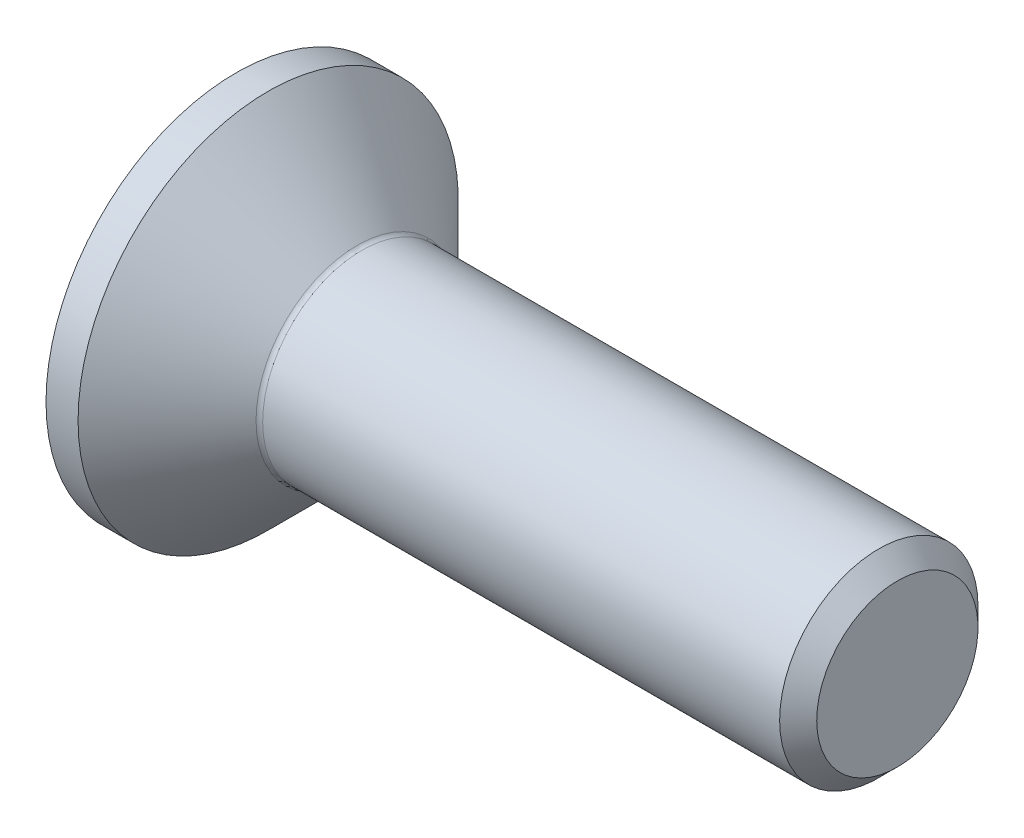
ISO-10303-21;
HEADER;
FILE_DESCRIPTION(('STEP AP214'),'2;1');
FILE_NAME('part.step','',(''),(''),'','','');
FILE_SCHEMA(('AUTOMOTIVE_DESIGN { 1 0 10303 214 1 1 1 1 }'));
ENDSEC;
DATA;
#1=APPLICATION_CONTEXT('core data for automotive mechanical design processes');
#2=APPLICATION_PROTOCOL_DEFINITION('international standard','automotive_design',2000,#1);
#3=PRODUCT_CONTEXT('',#1,'mechanical');
#4=PRODUCT('Part','Part','',(#3));
#5=PRODUCT_RELATED_PRODUCT_CATEGORY('part','',(#4));
#6=PRODUCT_DEFINITION_FORMATION('','',#4);
#7=PRODUCT_DEFINITION_CONTEXT('part definition',#1,'design');
#8=PRODUCT_DEFINITION('design','',#6,#7);
#9=PRODUCT_DEFINITION_SHAPE('','',#8);
#10=(LENGTH_UNIT() NAMED_UNIT(*) SI_UNIT(.MILLI.,.METRE.));
#11=(NAMED_UNIT(*) PLANE_ANGLE_UNIT() SI_UNIT($,.RADIAN.));
#12=(NAMED_UNIT(*) SI_UNIT($,.STERADIAN.) SOLID_ANGLE_UNIT());
#13=UNCERTAINTY_MEASURE_WITH_UNIT(LENGTH_MEASURE(1.E-05),#10,'distance_accuracy_value','');
#14=(GEOMETRIC_REPRESENTATION_CONTEXT(3) GLOBAL_UNCERTAINTY_ASSIGNED_CONTEXT((#13)) GLOBAL_UNIT_ASSIGNED_CONTEXT((#10,
#11,#12)) REPRESENTATION_CONTEXT('',''));
#15=CARTESIAN_POINT('',(0.,0.,0.));
#16=DIRECTION('',(0.,0.,1.));
#17=DIRECTION('',(1.,0.,0.));
#18=AXIS2_PLACEMENT_3D('',#15,#16,#17);
#19=CARTESIAN_POINT('',(0.,0.,0.));
#20=DIRECTION('',(-1.,0.,0.));
#21=DIRECTION('',(0.,0.,1.));
#22=AXIS2_PLACEMENT_3D('',#19,#20,#21);
#23=PLANE('',#22);
#24=CARTESIAN_POINT('',(0.,0.,0.));
#25=DIRECTION('',(-1.,0.,0.));
#26=DIRECTION('',(0.,0.,1.));
#27=AXIS2_PLACEMENT_3D('',#24,#25,#26);
#28=CIRCLE('',#27,2.875);
#29=CARTESIAN_POINT('',(0.,0.,2.875));
#30=VERTEX_POINT('',#29);
#31=EDGE_CURVE('E154',#30,#30,#28,.T.);
#32=ORIENTED_EDGE('',*,*,#31,.T.);
#33=EDGE_LOOP('',(#32));
#34=FACE_BOUND('',#33,.T.);
#35=DIRECTION('',(0.,-0.499999999999998,-0.86602540378444));
#36=VECTOR('',#35,1.);
#37=CARTESIAN_POINT('',(0.,-0.577350269189626,1.));
#38=LINE('',#37,#36);
#39=CARTESIAN_POINT('',(0.,-0.577350269189626,1.));
#40=VERTEX_POINT('',#39);
#41=CARTESIAN_POINT('',(0.,-1.15470053837925,0.));
#42=VERTEX_POINT('',#41);
#43=EDGE_CURVE('E120',#40,#42,#38,.T.);
#44=ORIENTED_EDGE('',*,*,#43,.T.);
#45=DIRECTION('',(0.,0.499999999999999,-0.866025403784439));
#46=VECTOR('',#45,1.);
#47=CARTESIAN_POINT('',(0.,-1.15470053837925,0.));
#48=LINE('',#47,#46);
#49=CARTESIAN_POINT('',(0.,-0.577350269189625,-1.));
#50=VERTEX_POINT('',#49);
#51=EDGE_CURVE('E51',#42,#50,#48,.T.);
#52=ORIENTED_EDGE('',*,*,#51,.T.);
#53=DIRECTION('',(0.,1.,0.));
#54=VECTOR('',#53,1.);
#55=CARTESIAN_POINT('',(0.,-0.577350269189625,-1.));
#56=LINE('',#55,#54);
#57=CARTESIAN_POINT('',(0.,0.577350269189626,-1.));
#58=VERTEX_POINT('',#57);
#59=EDGE_CURVE('E131',#50,#58,#56,.T.);
#60=ORIENTED_EDGE('',*,*,#59,.T.);
#61=DIRECTION('',(0.,0.5,0.866025403784439));
#62=VECTOR('',#61,1.);
#63=CARTESIAN_POINT('',(0.,0.577350269189626,-1.));
#64=LINE('',#63,#62);
#65=CARTESIAN_POINT('',(0.,1.15470053837925,0.));
#66=VERTEX_POINT('',#65);
#67=EDGE_CURVE('E255',#58,#66,#64,.T.);
#68=ORIENTED_EDGE('',*,*,#67,.T.);
#69=DIRECTION('',(0.,-0.499999999999999,0.866025403784439));
#70=VECTOR('',#69,1.);
#71=CARTESIAN_POINT('',(0.,1.15470053837925,0.));
#72=LINE('',#71,#70);
#73=CARTESIAN_POINT('',(0.,0.577350269189625,0.999999999999999));
#74=VERTEX_POINT('',#73);
#75=EDGE_CURVE('E258',#66,#74,#72,.T.);
#76=ORIENTED_EDGE('',*,*,#75,.T.);
#77=DIRECTION('',(0.,-1.,0.));
#78=VECTOR('',#77,1.);
#79=CARTESIAN_POINT('',(0.,0.577350269189625,0.999999999999999));
#80=LINE('',#79,#78);
#81=EDGE_CURVE('E261',#74,#40,#80,.T.);
#82=ORIENTED_EDGE('',*,*,#81,.T.);
#83=EDGE_LOOP('',(#44,#52,#60,#68,#76,#82));
#84=FACE_BOUND('',#83,.T.);
#85=ADVANCED_FACE('F36',(#34,#84),#23,.T.);
#86=CARTESIAN_POINT('',(0.,0.,0.));
#87=DIRECTION('',(-1.,0.,0.));
#88=DIRECTION('',(0.,0.,1.));
#89=AXIS2_PLACEMENT_3D('',#86,#87,#88);
#90=CYLINDRICAL_SURFACE('',#89,2.875);
#91=CARTESIAN_POINT('',(0.485000000000009,0.,0.));
#92=DIRECTION('',(-1.,0.,0.));
#93=DIRECTION('',(0.,0.,1.));
#94=AXIS2_PLACEMENT_3D('',#91,#92,#93);
#95=CIRCLE('',#94,2.875);
#96=CARTESIAN_POINT('',(0.485000000000009,0.,2.875));
#97=VERTEX_POINT('',#96);
#98=EDGE_CURVE('E151',#97,#97,#95,.T.);
#99=ORIENTED_EDGE('',*,*,#98,.T.);
#100=EDGE_LOOP('',(#99));
#101=FACE_BOUND('',#100,.T.);
#102=ORIENTED_EDGE('',*,*,#31,.F.);
#103=EDGE_LOOP('',(#102));
#104=FACE_BOUND('',#103,.T.);
#105=ADVANCED_FACE('F175',(#101,#104),#90,.T.);
#106=CARTESIAN_POINT('',(0.485000000000009,0.,0.));
#107=DIRECTION('',(-1.,0.,0.));
#108=DIRECTION('',(0.,0.,1.));
#109=AXIS2_PLACEMENT_3D('',#106,#107,#108);
#110=CONICAL_SURFACE('',#109,2.875,0.785398163397449);
#111=CARTESIAN_POINT('',(1.83071067811874,0.,0.));
#112=DIRECTION('',(-1.,0.,0.));
#113=DIRECTION('',(0.,0.,1.));
#114=AXIS2_PLACEMENT_3D('',#111,#112,#113);
#115=CIRCLE('',#114,1.52928932188126);
#116=CARTESIAN_POINT('',(1.83071067811874,0.,1.52928932188126));
#117=VERTEX_POINT('',#116);
#118=EDGE_CURVE('E44',#117,#117,#115,.T.);
#119=ORIENTED_EDGE('',*,*,#118,.T.);
#120=EDGE_LOOP('',(#119));
#121=FACE_BOUND('',#120,.T.);
#122=ORIENTED_EDGE('',*,*,#98,.F.);
#123=EDGE_LOOP('',(#122));
#124=FACE_BOUND('',#123,.T.);
#125=ADVANCED_FACE('F159',(#121,#124),#110,.T.);
#126=CARTESIAN_POINT('',(0.,0.,0.));
#127=DIRECTION('',(-1.,0.,0.));
#128=DIRECTION('',(0.,0.,1.));
#129=AXIS2_PLACEMENT_3D('',#126,#127,#128);
#130=CYLINDRICAL_SURFACE('',#129,1.49999999999992);
#131=CARTESIAN_POINT('',(1.9014213562374,0.,0.));
#132=DIRECTION('',(-1.,0.,0.));
#133=DIRECTION('',(0.,0.,1.));
#134=AXIS2_PLACEMENT_3D('',#131,#132,#133);
#135=CIRCLE('',#134,1.49999999999992);
#136=CARTESIAN_POINT('',(1.9014213562374,0.,1.49999999999992));
#137=VERTEX_POINT('',#136);
#138=EDGE_CURVE('E11',#137,#137,#135,.F.);
#139=ORIENTED_EDGE('',*,*,#138,.T.);
#140=EDGE_LOOP('',(#139));
#141=FACE_BOUND('',#140,.T.);
#142=CARTESIAN_POINT('',(9.71949999999984,0.,0.));
#143=DIRECTION('',(-1.,0.,0.));
#144=DIRECTION('',(0.,0.,1.));
#145=AXIS2_PLACEMENT_3D('',#142,#143,#144);
#146=CIRCLE('',#145,1.49999999999983);
#147=CARTESIAN_POINT('',(9.71949999999984,0.,1.49999999999983));
#148=VERTEX_POINT('',#147);
#149=EDGE_CURVE('E148',#148,#148,#146,.T.);
#150=ORIENTED_EDGE('',*,*,#149,.T.);
#151=EDGE_LOOP('',(#150));
#152=FACE_BOUND('',#151,.T.);
#153=ADVANCED_FACE('F186',(#141,#152),#130,.T.);
#154=CARTESIAN_POINT('',(10.,0.,0.));
#155=DIRECTION('',(-1.,0.,0.));
#156=DIRECTION('',(0.,0.,1.));
#157=AXIS2_PLACEMENT_3D('',#154,#155,#156);
#158=CONICAL_SURFACE('',#157,1.2195,0.785398163396872);
#159=ORIENTED_EDGE('',*,*,#149,.F.);
#160=EDGE_LOOP('',(#159));
#161=FACE_BOUND('',#160,.T.);
#162=CARTESIAN_POINT('',(10.,0.,0.));
#163=DIRECTION('',(-1.,0.,0.));
#164=DIRECTION('',(0.,0.,1.));
#165=AXIS2_PLACEMENT_3D('',#162,#163,#164);
#166=CIRCLE('',#165,1.2195);
#167=CARTESIAN_POINT('',(10.,0.,1.2195));
#168=VERTEX_POINT('',#167);
#169=EDGE_CURVE('E144',#168,#168,#166,.T.);
#170=ORIENTED_EDGE('',*,*,#169,.T.);
#171=EDGE_LOOP('',(#170));
#172=FACE_BOUND('',#171,.T.);
#173=ADVANCED_FACE('F170',(#161,#172),#158,.T.);
#174=CARTESIAN_POINT('',(10.,1.2195,0.));
#175=DIRECTION('',(1.,0.,0.));
#176=DIRECTION('',(0.,0.,-1.));
#177=AXIS2_PLACEMENT_3D('',#174,#175,#176);
#178=PLANE('',#177);
#179=ORIENTED_EDGE('',*,*,#169,.F.);
#180=EDGE_LOOP('',(#179));
#181=FACE_BOUND('',#180,.T.);
#182=ADVANCED_FACE('F163',(#181),#178,.T.);
#183=CARTESIAN_POINT('',(1.9014213562374,0.,0.));
#184=DIRECTION('',(-1.,0.,0.));
#185=DIRECTION('',(0.,0.,1.));
#186=AXIS2_PLACEMENT_3D('',#183,#184,#185);
#187=TOROIDAL_SURFACE('',#186,1.59999999999992,0.1);
#188=ORIENTED_EDGE('',*,*,#138,.F.);
#189=EDGE_LOOP('',(#188));
#190=FACE_BOUND('',#189,.T.);
#191=ORIENTED_EDGE('',*,*,#118,.F.);
#192=EDGE_LOOP('',(#191));
#193=FACE_BOUND('',#192,.T.);
#194=ADVANCED_FACE('F38',(#190,#193),#187,.F.);
#195=CARTESIAN_POINT('',(1.1,-1.15470053837925,0.));
#196=DIRECTION('',(0.,0.866025403784439,0.499999999999999));
#197=DIRECTION('',(0.,-0.499999999999999,0.866025403784439));
#198=AXIS2_PLACEMENT_3D('',#195,#196,#197);
#199=PLANE('',#198);
#200=ORIENTED_EDGE('',*,*,#51,.F.);
#201=DIRECTION('',(-1.,0.,0.));
#202=VECTOR('',#201,1.);
#203=CARTESIAN_POINT('',(1.1,-1.15470053837925,0.));
#204=LINE('',#203,#202);
#205=CARTESIAN_POINT('',(1.1,-1.15470053837925,0.));
#206=VERTEX_POINT('',#205);
#207=EDGE_CURVE('E252',#206,#42,#204,.T.);
#208=ORIENTED_EDGE('',*,*,#207,.F.);
#209=DIRECTION('',(0.,0.499999999999999,-0.866025403784439));
#210=VECTOR('',#209,1.);
#211=CARTESIAN_POINT('',(1.1,-1.15470053837925,0.));
#212=LINE('',#211,#210);
#213=CARTESIAN_POINT('',(1.1,-0.866025403784438,-0.499999999999998));
#214=VERTEX_POINT('',#213);
#215=EDGE_CURVE('E116',#206,#214,#212,.T.);
#216=ORIENTED_EDGE('',*,*,#215,.T.);
#217=CARTESIAN_POINT('',(1.1,-0.577350269189625,-1.));
#218=VERTEX_POINT('',#217);
#219=EDGE_CURVE('E112',#214,#218,#212,.T.);
#220=ORIENTED_EDGE('',*,*,#219,.T.);
#221=DIRECTION('',(-1.,0.,0.));
#222=VECTOR('',#221,1.);
#223=CARTESIAN_POINT('',(1.1,-0.577350269189625,-1.));
#224=LINE('',#223,#222);
#225=EDGE_CURVE('E114',#218,#50,#224,.T.);
#226=ORIENTED_EDGE('',*,*,#225,.T.);
#227=EDGE_LOOP('',(#200,#208,#216,#220,#226));
#228=FACE_BOUND('',#227,.T.);
#229=ADVANCED_FACE('F113',(#228),#199,.T.);
#230=CARTESIAN_POINT('',(1.1,-0.577350269189625,-1.));
#231=DIRECTION('',(0.,0.,1.));
#232=DIRECTION('',(1.,0.,0.));
#233=AXIS2_PLACEMENT_3D('',#230,#231,#232);
#234=PLANE('',#233);
#235=ORIENTED_EDGE('',*,*,#59,.F.);
#236=ORIENTED_EDGE('',*,*,#225,.F.);
#237=DIRECTION('',(0.,1.,0.));
#238=VECTOR('',#237,1.);
#239=CARTESIAN_POINT('',(1.1,-0.577350269189625,-1.));
#240=LINE('',#239,#238);
#241=CARTESIAN_POINT('',(1.1,0.,-1.));
#242=VERTEX_POINT('',#241);
#243=EDGE_CURVE('E59',#218,#242,#240,.T.);
#244=ORIENTED_EDGE('',*,*,#243,.T.);
#245=CARTESIAN_POINT('',(1.1,0.577350269189626,-1.));
#246=VERTEX_POINT('',#245);
#247=EDGE_CURVE('E126',#242,#246,#240,.T.);
#248=ORIENTED_EDGE('',*,*,#247,.T.);
#249=DIRECTION('',(-1.,0.,0.));
#250=VECTOR('',#249,1.);
#251=CARTESIAN_POINT('',(1.1,0.577350269189626,-1.));
#252=LINE('',#251,#250);
#253=EDGE_CURVE('E133',#246,#58,#252,.T.);
#254=ORIENTED_EDGE('',*,*,#253,.T.);
#255=EDGE_LOOP('',(#235,#236,#244,#248,#254));
#256=FACE_BOUND('',#255,.T.);
#257=ADVANCED_FACE('F128',(#256),#234,.T.);
#258=CARTESIAN_POINT('',(1.1,0.577350269189626,-1.));
#259=DIRECTION('',(0.,-0.866025403784438,0.5));
#260=DIRECTION('',(0.,-0.5,-0.866025403784439));
#261=AXIS2_PLACEMENT_3D('',#258,#259,#260);
#262=PLANE('',#261);
#263=ORIENTED_EDGE('',*,*,#67,.F.);
#264=ORIENTED_EDGE('',*,*,#253,.F.);
#265=DIRECTION('',(0.,0.5,0.866025403784439));
#266=VECTOR('',#265,1.);
#267=CARTESIAN_POINT('',(1.1,0.577350269189626,-1.));
#268=LINE('',#267,#266);
#269=CARTESIAN_POINT('',(1.1,0.866025403784439,-0.5));
#270=VERTEX_POINT('',#269);
#271=EDGE_CURVE('E233',#246,#270,#268,.T.);
#272=ORIENTED_EDGE('',*,*,#271,.T.);
#273=CARTESIAN_POINT('',(1.1,1.15470053837925,0.));
#274=VERTEX_POINT('',#273);
#275=EDGE_CURVE('E125',#270,#274,#268,.T.);
#276=ORIENTED_EDGE('',*,*,#275,.T.);
#277=DIRECTION('',(-1.,0.,0.));
#278=VECTOR('',#277,1.);
#279=CARTESIAN_POINT('',(1.1,1.15470053837925,0.));
#280=LINE('',#279,#278);
#281=EDGE_CURVE('E139',#274,#66,#280,.T.);
#282=ORIENTED_EDGE('',*,*,#281,.T.);
#283=EDGE_LOOP('',(#263,#264,#272,#276,#282));
#284=FACE_BOUND('',#283,.T.);
#285=ADVANCED_FACE('F200',(#284),#262,.T.);
#286=CARTESIAN_POINT('',(1.1,1.15470053837925,0.));
#287=DIRECTION('',(0.,-0.866025403784439,-0.499999999999999));
#288=DIRECTION('',(0.,0.499999999999999,-0.866025403784439));
#289=AXIS2_PLACEMENT_3D('',#286,#287,#288);
#290=PLANE('',#289);
#291=ORIENTED_EDGE('',*,*,#75,.F.);
#292=ORIENTED_EDGE('',*,*,#281,.F.);
#293=DIRECTION('',(0.,-0.499999999999999,0.866025403784439));
#294=VECTOR('',#293,1.);
#295=CARTESIAN_POINT('',(1.1,1.15470053837925,0.));
#296=LINE('',#295,#294);
#297=CARTESIAN_POINT('',(1.1,0.866025403784438,0.499999999999999));
#298=VERTEX_POINT('',#297);
#299=EDGE_CURVE('E240',#274,#298,#296,.T.);
#300=ORIENTED_EDGE('',*,*,#299,.T.);
#301=CARTESIAN_POINT('',(1.1,0.577350269189625,0.999999999999999));
#302=VERTEX_POINT('',#301);
#303=EDGE_CURVE('E238',#298,#302,#296,.T.);
#304=ORIENTED_EDGE('',*,*,#303,.T.);
#305=DIRECTION('',(-1.,0.,0.));
#306=VECTOR('',#305,1.);
#307=CARTESIAN_POINT('',(1.1,0.577350269189625,0.999999999999999));
#308=LINE('',#307,#306);
#309=EDGE_CURVE('E270',#302,#74,#308,.T.);
#310=ORIENTED_EDGE('',*,*,#309,.T.);
#311=EDGE_LOOP('',(#291,#292,#300,#304,#310));
#312=FACE_BOUND('',#311,.T.);
#313=ADVANCED_FACE('F203',(#312),#290,.T.);
#314=CARTESIAN_POINT('',(1.1,0.577350269189625,0.999999999999999));
#315=DIRECTION('',(0.,0.,-1.));
#316=DIRECTION('',(0.,1.,0.));
#317=AXIS2_PLACEMENT_3D('',#314,#315,#316);
#318=PLANE('',#317);
#319=ORIENTED_EDGE('',*,*,#81,.F.);
#320=ORIENTED_EDGE('',*,*,#309,.F.);
#321=DIRECTION('',(0.,-1.,0.));
#322=VECTOR('',#321,1.);
#323=CARTESIAN_POINT('',(1.1,0.577350269189625,0.999999999999999));
#324=LINE('',#323,#322);
#325=CARTESIAN_POINT('',(1.1,0.,1.));
#326=VERTEX_POINT('',#325);
#327=EDGE_CURVE('E245',#302,#326,#324,.T.);
#328=ORIENTED_EDGE('',*,*,#327,.T.);
#329=CARTESIAN_POINT('',(1.1,-0.577350269189626,1.));
#330=VERTEX_POINT('',#329);
#331=EDGE_CURVE('E244',#326,#330,#324,.T.);
#332=ORIENTED_EDGE('',*,*,#331,.T.);
#333=DIRECTION('',(-1.,0.,0.));
#334=VECTOR('',#333,1.);
#335=CARTESIAN_POINT('',(1.1,-0.577350269189626,1.));
#336=LINE('',#335,#334);
#337=EDGE_CURVE('E267',#330,#40,#336,.T.);
#338=ORIENTED_EDGE('',*,*,#337,.T.);
#339=EDGE_LOOP('',(#319,#320,#328,#332,#338));
#340=FACE_BOUND('',#339,.T.);
#341=ADVANCED_FACE('F207',(#340),#318,.T.);
#342=CARTESIAN_POINT('',(1.1,-0.577350269189626,1.));
#343=DIRECTION('',(0.,0.86602540378444,-0.499999999999998));
#344=DIRECTION('',(0.,0.499999999999998,0.86602540378444));
#345=AXIS2_PLACEMENT_3D('',#342,#343,#344);
#346=PLANE('',#345);
#347=ORIENTED_EDGE('',*,*,#43,.F.);
#348=ORIENTED_EDGE('',*,*,#337,.F.);
#349=DIRECTION('',(0.,-0.499999999999998,-0.86602540378444));
#350=VECTOR('',#349,1.);
#351=CARTESIAN_POINT('',(1.1,-0.577350269189626,1.));
#352=LINE('',#351,#350);
#353=CARTESIAN_POINT('',(1.1,-0.866025403784439,0.499999999999997));
#354=VERTEX_POINT('',#353);
#355=EDGE_CURVE('E249',#330,#354,#352,.T.);
#356=ORIENTED_EDGE('',*,*,#355,.T.);
#357=EDGE_CURVE('E248',#354,#206,#352,.T.);
#358=ORIENTED_EDGE('',*,*,#357,.T.);
#359=ORIENTED_EDGE('',*,*,#207,.T.);
#360=EDGE_LOOP('',(#347,#348,#356,#358,#359));
#361=FACE_BOUND('',#360,.T.);
#362=ADVANCED_FACE('F211',(#361),#346,.T.);
#363=CARTESIAN_POINT('',(1.1,-0.577350269189626,-1.));
#364=DIRECTION('',(1.,0.,0.));
#365=DIRECTION('',(0.,0.,-1.));
#366=AXIS2_PLACEMENT_3D('',#363,#364,#365);
#367=PLANE('',#366);
#368=ORIENTED_EDGE('',*,*,#243,.F.);
#369=ORIENTED_EDGE('',*,*,#219,.F.);
#370=CARTESIAN_POINT('',(1.1,0.,0.));
#371=DIRECTION('',(-1.,0.,0.));
#372=DIRECTION('',(0.,0.,1.));
#373=AXIS2_PLACEMENT_3D('',#370,#371,#372);
#374=CIRCLE('',#373,1.);
#375=EDGE_CURVE('E123',#242,#214,#374,.T.);
#376=ORIENTED_EDGE('',*,*,#375,.F.);
#377=EDGE_LOOP('',(#368,#369,#376));
#378=FACE_BOUND('',#377,.T.);
#379=ADVANCED_FACE('F122',(#378),#367,.F.);
#380=ORIENTED_EDGE('',*,*,#215,.F.);
#381=ORIENTED_EDGE('',*,*,#357,.F.);
#382=EDGE_CURVE('E136',#214,#354,#374,.T.);
#383=ORIENTED_EDGE('',*,*,#382,.F.);
#384=EDGE_LOOP('',(#380,#381,#383));
#385=FACE_BOUND('',#384,.T.);
#386=ADVANCED_FACE('F217',(#385),#367,.F.);
#387=ORIENTED_EDGE('',*,*,#355,.F.);
#388=ORIENTED_EDGE('',*,*,#331,.F.);
#389=EDGE_CURVE('E132',#354,#326,#374,.T.);
#390=ORIENTED_EDGE('',*,*,#389,.F.);
#391=EDGE_LOOP('',(#387,#388,#390));
#392=FACE_BOUND('',#391,.T.);
#393=ADVANCED_FACE('F221',(#392),#367,.F.);
#394=ORIENTED_EDGE('',*,*,#327,.F.);
#395=ORIENTED_EDGE('',*,*,#303,.F.);
#396=EDGE_CURVE('E138',#326,#298,#374,.T.);
#397=ORIENTED_EDGE('',*,*,#396,.F.);
#398=EDGE_LOOP('',(#394,#395,#397));
#399=FACE_BOUND('',#398,.T.);
#400=ADVANCED_FACE('F229',(#399),#367,.F.);
#401=ORIENTED_EDGE('',*,*,#299,.F.);
#402=ORIENTED_EDGE('',*,*,#275,.F.);
#403=EDGE_CURVE('E145',#298,#270,#374,.T.);
#404=ORIENTED_EDGE('',*,*,#403,.F.);
#405=EDGE_LOOP('',(#401,#402,#404));
#406=FACE_BOUND('',#405,.T.);
#407=ADVANCED_FACE('F224',(#406),#367,.F.);
#408=ORIENTED_EDGE('',*,*,#271,.F.);
#409=ORIENTED_EDGE('',*,*,#247,.F.);
#410=EDGE_CURVE('E234',#270,#242,#374,.T.);
#411=ORIENTED_EDGE('',*,*,#410,.F.);
#412=EDGE_LOOP('',(#408,#409,#411));
#413=FACE_BOUND('',#412,.T.);
#414=ADVANCED_FACE('F195',(#413),#367,.F.);
#415=CARTESIAN_POINT('',(1.1,0.,0.));
#416=DIRECTION('',(-1.,0.,0.));
#417=DIRECTION('',(0.,0.,1.));
#418=AXIS2_PLACEMENT_3D('',#415,#416,#417);
#419=CONICAL_SURFACE('',#418,1.,1.04719755119659);
#420=CARTESIAN_POINT('',(1.67735026918963,0.,0.));
#421=VERTEX_POINT('',#420);
#422=VERTEX_LOOP('',#421);
#423=FACE_BOUND('',#422,.T.);
#424=ORIENTED_EDGE('',*,*,#396,.T.);
#425=ORIENTED_EDGE('',*,*,#403,.T.);
#426=ORIENTED_EDGE('',*,*,#410,.T.);
#427=ORIENTED_EDGE('',*,*,#375,.T.);
#428=ORIENTED_EDGE('',*,*,#382,.T.);
#429=ORIENTED_EDGE('',*,*,#389,.T.);
#430=EDGE_LOOP('',(#424,#425,#426,#427,#428,#429));
#431=FACE_BOUND('',#430,.T.);
#432=ADVANCED_FACE('F193',(#423,#431),#419,.F.);
#433=CLOSED_SHELL('',(#85,#105,#125,#153,#173,#182,#194,#229,#257,#285,#313,#341,#362,#379,#386,
#393,#400,#407,#414,#432));
#434=MANIFOLD_SOLID_BREP('B2',#433);
#435=ADVANCED_BREP_SHAPE_REPRESENTATION('',(#18,#434),#14);
#436=SHAPE_DEFINITION_REPRESENTATION(#9,#435);
ENDSEC;
END-ISO-10303-21;
